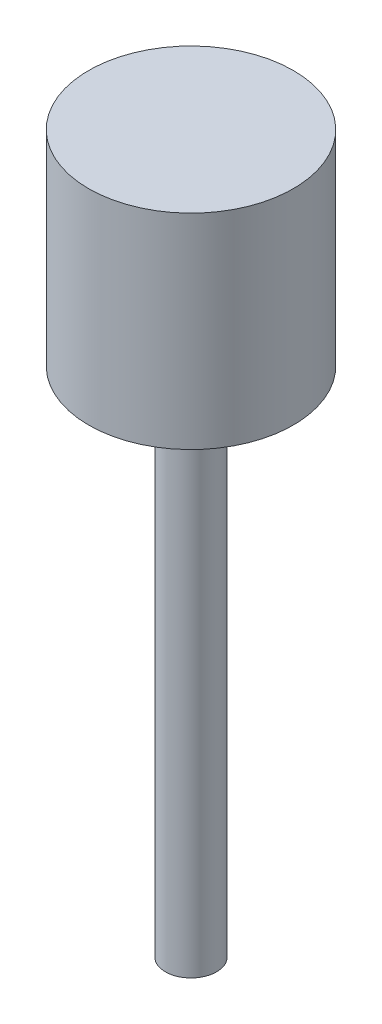
ISO-10303-21;
HEADER;
FILE_DESCRIPTION(('STEP AP214'),'2;1');
FILE_NAME('part.step','',(''),(''),'','','');
FILE_SCHEMA(('AUTOMOTIVE_DESIGN { 1 0 10303 214 1 1 1 1 }'));
ENDSEC;
DATA;
#1=APPLICATION_CONTEXT('core data for automotive mechanical design processes');
#2=APPLICATION_PROTOCOL_DEFINITION('international standard','automotive_design',2000,#1);
#3=PRODUCT_CONTEXT('',#1,'mechanical');
#4=PRODUCT('Part','Part','',(#3));
#5=PRODUCT_RELATED_PRODUCT_CATEGORY('part','',(#4));
#6=PRODUCT_DEFINITION_FORMATION('','',#4);
#7=PRODUCT_DEFINITION_CONTEXT('part definition',#1,'design');
#8=PRODUCT_DEFINITION('design','',#6,#7);
#9=PRODUCT_DEFINITION_SHAPE('','',#8);
#10=(LENGTH_UNIT() NAMED_UNIT(*) SI_UNIT(.MILLI.,.METRE.));
#11=(NAMED_UNIT(*) PLANE_ANGLE_UNIT() SI_UNIT($,.RADIAN.));
#12=(NAMED_UNIT(*) SI_UNIT($,.STERADIAN.) SOLID_ANGLE_UNIT());
#13=UNCERTAINTY_MEASURE_WITH_UNIT(LENGTH_MEASURE(1.E-05),#10,'distance_accuracy_value','');
#14=(GEOMETRIC_REPRESENTATION_CONTEXT(3) GLOBAL_UNCERTAINTY_ASSIGNED_CONTEXT((#13)) GLOBAL_UNIT_ASSIGNED_CONTEXT((#10,
#11,#12)) REPRESENTATION_CONTEXT('',''));
#15=CARTESIAN_POINT('',(0.,0.,0.));
#16=DIRECTION('',(0.,0.,1.));
#17=DIRECTION('',(1.,0.,0.));
#18=AXIS2_PLACEMENT_3D('',#15,#16,#17);
#19=CARTESIAN_POINT('',(2.50000000000001,0.,0.));
#20=DIRECTION('',(0.,-1.,0.));
#21=DIRECTION('',(0.,0.,-1.));
#22=AXIS2_PLACEMENT_3D('',#19,#20,#21);
#23=PLANE('',#22);
#24=CARTESIAN_POINT('',(0.,0.,0.));
#25=DIRECTION('',(0.,-1.,0.));
#26=DIRECTION('',(0.,0.,-1.));
#27=AXIS2_PLACEMENT_3D('',#24,#25,#26);
#28=CIRCLE('',#27,2.50000000000001);
#29=CARTESIAN_POINT('',(0.,0.,-2.50000000000001));
#30=VERTEX_POINT('',#29);
#31=EDGE_CURVE('E47',#30,#30,#28,.T.);
#32=ORIENTED_EDGE('',*,*,#31,.T.);
#33=EDGE_LOOP('',(#32));
#34=FACE_BOUND('',#33,.T.);
#35=ADVANCED_FACE('F33',(#34),#23,.T.);
#36=CARTESIAN_POINT('',(0.,70.,0.));
#37=DIRECTION('',(0.,1.,0.));
#38=DIRECTION('',(0.,0.,1.));
#39=AXIS2_PLACEMENT_3D('',#36,#37,#38);
#40=PLANE('',#39);
#41=CARTESIAN_POINT('',(0.,70.,0.));
#42=DIRECTION('',(0.,-1.,0.));
#43=DIRECTION('',(0.,0.,-1.));
#44=AXIS2_PLACEMENT_3D('',#41,#42,#43);
#45=CIRCLE('',#44,10.);
#46=CARTESIAN_POINT('',(0.,70.,-10.));
#47=VERTEX_POINT('',#46);
#48=EDGE_CURVE('E10',#47,#47,#45,.T.);
#49=ORIENTED_EDGE('',*,*,#48,.F.);
#50=EDGE_LOOP('',(#49));
#51=FACE_BOUND('',#50,.T.);
#52=ADVANCED_FACE('F65',(#51),#40,.T.);
#53=CARTESIAN_POINT('',(0.,0.,0.));
#54=DIRECTION('',(0.,-1.,0.));
#55=DIRECTION('',(0.,0.,-1.));
#56=AXIS2_PLACEMENT_3D('',#53,#54,#55);
#57=CYLINDRICAL_SURFACE('',#56,10.);
#58=ORIENTED_EDGE('',*,*,#48,.T.);
#59=EDGE_LOOP('',(#58));
#60=FACE_BOUND('',#59,.T.);
#61=CARTESIAN_POINT('',(0.,50.,0.));
#62=DIRECTION('',(0.,-1.,0.));
#63=DIRECTION('',(0.,0.,-1.));
#64=AXIS2_PLACEMENT_3D('',#61,#62,#63);
#65=CIRCLE('',#64,10.);
#66=CARTESIAN_POINT('',(0.,50.,-10.));
#67=VERTEX_POINT('',#66);
#68=EDGE_CURVE('E39',#67,#67,#65,.T.);
#69=ORIENTED_EDGE('',*,*,#68,.F.);
#70=EDGE_LOOP('',(#69));
#71=FACE_BOUND('',#70,.T.);
#72=ADVANCED_FACE('F62',(#60,#71),#57,.T.);
#73=CARTESIAN_POINT('',(10.,50.,0.));
#74=DIRECTION('',(0.,-1.,0.));
#75=DIRECTION('',(0.,0.,-1.));
#76=AXIS2_PLACEMENT_3D('',#73,#74,#75);
#77=PLANE('',#76);
#78=ORIENTED_EDGE('',*,*,#68,.T.);
#79=EDGE_LOOP('',(#78));
#80=FACE_BOUND('',#79,.T.);
#81=CARTESIAN_POINT('',(0.,50.,0.));
#82=DIRECTION('',(0.,-1.,0.));
#83=DIRECTION('',(0.,0.,-1.));
#84=AXIS2_PLACEMENT_3D('',#81,#82,#83);
#85=CIRCLE('',#84,2.5);
#86=CARTESIAN_POINT('',(0.,50.,-2.5));
#87=VERTEX_POINT('',#86);
#88=EDGE_CURVE('E43',#87,#87,#85,.T.);
#89=ORIENTED_EDGE('',*,*,#88,.F.);
#90=EDGE_LOOP('',(#89));
#91=FACE_BOUND('',#90,.T.);
#92=ADVANCED_FACE('F56',(#80,#91),#77,.T.);
#93=CARTESIAN_POINT('',(0.,0.,0.));
#94=DIRECTION('',(0.,-1.,0.));
#95=DIRECTION('',(0.,0.,-1.));
#96=AXIS2_PLACEMENT_3D('',#93,#94,#95);
#97=CYLINDRICAL_SURFACE('',#96,2.5);
#98=ORIENTED_EDGE('',*,*,#88,.T.);
#99=EDGE_LOOP('',(#98));
#100=FACE_BOUND('',#99,.T.);
#101=ORIENTED_EDGE('',*,*,#31,.F.);
#102=EDGE_LOOP('',(#101));
#103=FACE_BOUND('',#102,.T.);
#104=ADVANCED_FACE('F54',(#100,#103),#97,.T.);
#105=CLOSED_SHELL('',(#35,#52,#72,#92,#104));
#106=MANIFOLD_SOLID_BREP('B2',#105);
#107=ADVANCED_BREP_SHAPE_REPRESENTATION('',(#18,#106),#14);
#108=SHAPE_DEFINITION_REPRESENTATION(#9,#107);
ENDSEC;
END-ISO-10303-21;
